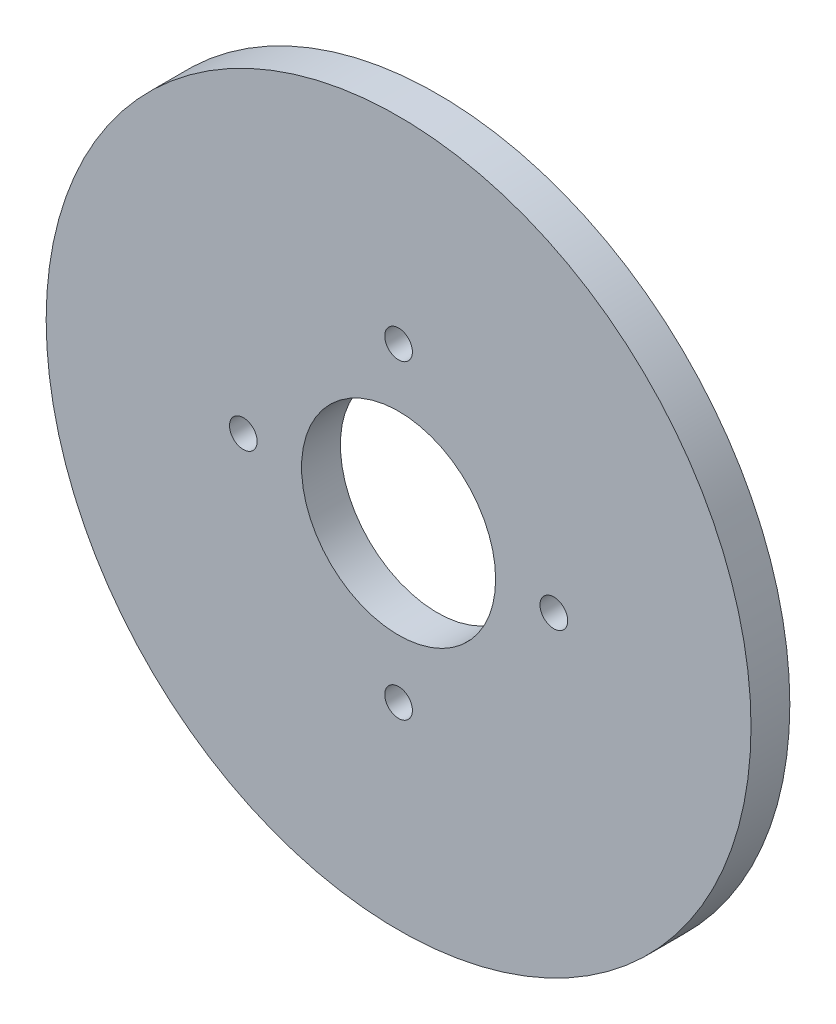
ISO-10303-21;
HEADER;
FILE_DESCRIPTION(('STEP AP214'),'2;1');
FILE_NAME('part.step','',(''),(''),'','','');
FILE_SCHEMA(('AUTOMOTIVE_DESIGN { 1 0 10303 214 1 1 1 1 }'));
ENDSEC;
DATA;
#1=APPLICATION_CONTEXT('core data for automotive mechanical design processes');
#2=APPLICATION_PROTOCOL_DEFINITION('international standard','automotive_design',2000,#1);
#3=PRODUCT_CONTEXT('',#1,'mechanical');
#4=PRODUCT('Part','Part','',(#3));
#5=PRODUCT_RELATED_PRODUCT_CATEGORY('part','',(#4));
#6=PRODUCT_DEFINITION_FORMATION('','',#4);
#7=PRODUCT_DEFINITION_CONTEXT('part definition',#1,'design');
#8=PRODUCT_DEFINITION('design','',#6,#7);
#9=PRODUCT_DEFINITION_SHAPE('','',#8);
#10=(LENGTH_UNIT() NAMED_UNIT(*) SI_UNIT(.MILLI.,.METRE.));
#11=(NAMED_UNIT(*) PLANE_ANGLE_UNIT() SI_UNIT($,.RADIAN.));
#12=(NAMED_UNIT(*) SI_UNIT($,.STERADIAN.) SOLID_ANGLE_UNIT());
#13=UNCERTAINTY_MEASURE_WITH_UNIT(LENGTH_MEASURE(1.E-05),#10,'distance_accuracy_value','');
#14=(GEOMETRIC_REPRESENTATION_CONTEXT(3) GLOBAL_UNCERTAINTY_ASSIGNED_CONTEXT((#13)) GLOBAL_UNIT_ASSIGNED_CONTEXT((#10,
#11,#12)) REPRESENTATION_CONTEXT('',''));
#15=CARTESIAN_POINT('',(0.,0.,0.));
#16=DIRECTION('',(0.,0.,1.));
#17=DIRECTION('',(1.,0.,0.));
#18=AXIS2_PLACEMENT_3D('',#15,#16,#17);
#19=CARTESIAN_POINT('',(0.,0.,3.175));
#20=DIRECTION('',(0.,0.,1.));
#21=DIRECTION('',(1.,0.,0.));
#22=AXIS2_PLACEMENT_3D('',#19,#20,#21);
#23=PLANE('',#22);
#24=CARTESIAN_POINT('',(0.,12.7,3.175));
#25=DIRECTION('',(0.,0.,1.));
#26=DIRECTION('',(1.,0.,0.));
#27=AXIS2_PLACEMENT_3D('',#24,#25,#26);
#28=CIRCLE('',#27,1.1303);
#29=CARTESIAN_POINT('',(1.1303,12.7,3.175));
#30=VERTEX_POINT('',#29);
#31=EDGE_CURVE('E63',#30,#30,#28,.T.);
#32=ORIENTED_EDGE('',*,*,#31,.F.);
#33=EDGE_LOOP('',(#32));
#34=FACE_BOUND('',#33,.T.);
#35=CARTESIAN_POINT('',(0.,-12.7,3.175));
#36=DIRECTION('',(0.,0.,1.));
#37=DIRECTION('',(1.,0.,0.));
#38=AXIS2_PLACEMENT_3D('',#35,#36,#37);
#39=CIRCLE('',#38,1.1303);
#40=CARTESIAN_POINT('',(1.1303,-12.7,3.175));
#41=VERTEX_POINT('',#40);
#42=EDGE_CURVE('E52',#41,#41,#39,.T.);
#43=ORIENTED_EDGE('',*,*,#42,.F.);
#44=EDGE_LOOP('',(#43));
#45=FACE_BOUND('',#44,.T.);
#46=CARTESIAN_POINT('',(12.7,0.,3.175));
#47=DIRECTION('',(0.,0.,1.));
#48=DIRECTION('',(1.,0.,0.));
#49=AXIS2_PLACEMENT_3D('',#46,#47,#48);
#50=CIRCLE('',#49,1.1303);
#51=CARTESIAN_POINT('',(13.8303,0.,3.175));
#52=VERTEX_POINT('',#51);
#53=EDGE_CURVE('E51',#52,#52,#50,.T.);
#54=ORIENTED_EDGE('',*,*,#53,.F.);
#55=EDGE_LOOP('',(#54));
#56=FACE_BOUND('',#55,.T.);
#57=CARTESIAN_POINT('',(-12.7,0.,3.175));
#58=DIRECTION('',(0.,0.,1.));
#59=DIRECTION('',(1.,0.,0.));
#60=AXIS2_PLACEMENT_3D('',#57,#58,#59);
#61=CIRCLE('',#60,1.1303);
#62=CARTESIAN_POINT('',(-11.5697,0.,3.175));
#63=VERTEX_POINT('',#62);
#64=EDGE_CURVE('E68',#63,#63,#61,.T.);
#65=ORIENTED_EDGE('',*,*,#64,.F.);
#66=EDGE_LOOP('',(#65));
#67=FACE_BOUND('',#66,.T.);
#68=CARTESIAN_POINT('',(0.,0.,3.175));
#69=DIRECTION('',(0.,0.,1.));
#70=DIRECTION('',(1.,0.,0.));
#71=AXIS2_PLACEMENT_3D('',#68,#69,#70);
#72=CIRCLE('',#71,28.829);
#73=CARTESIAN_POINT('',(28.829,0.,3.175));
#74=VERTEX_POINT('',#73);
#75=EDGE_CURVE('E10',#74,#74,#72,.T.);
#76=ORIENTED_EDGE('',*,*,#75,.T.);
#77=EDGE_LOOP('',(#76));
#78=FACE_BOUND('',#77,.T.);
#79=CARTESIAN_POINT('',(0.,0.,3.175));
#80=DIRECTION('',(0.,0.,1.));
#81=DIRECTION('',(1.,0.,0.));
#82=AXIS2_PLACEMENT_3D('',#79,#80,#81);
#83=CIRCLE('',#82,7.9375);
#84=CARTESIAN_POINT('',(7.9375,0.,3.175));
#85=VERTEX_POINT('',#84);
#86=EDGE_CURVE('E44',#85,#85,#83,.T.);
#87=ORIENTED_EDGE('',*,*,#86,.F.);
#88=EDGE_LOOP('',(#87));
#89=FACE_BOUND('',#88,.T.);
#90=ADVANCED_FACE('F31',(#34,#45,#56,#67,#78,#89),#23,.T.);
#91=CARTESIAN_POINT('',(0.,0.,0.));
#92=DIRECTION('',(0.,0.,1.));
#93=DIRECTION('',(1.,0.,0.));
#94=AXIS2_PLACEMENT_3D('',#91,#92,#93);
#95=PLANE('',#94);
#96=CARTESIAN_POINT('',(0.,12.7,0.));
#97=DIRECTION('',(0.,0.,1.));
#98=DIRECTION('',(1.,0.,0.));
#99=AXIS2_PLACEMENT_3D('',#96,#97,#98);
#100=CIRCLE('',#99,1.1303);
#101=CARTESIAN_POINT('',(1.1303,12.7,0.));
#102=VERTEX_POINT('',#101);
#103=EDGE_CURVE('E35',#102,#102,#100,.T.);
#104=ORIENTED_EDGE('',*,*,#103,.T.);
#105=EDGE_LOOP('',(#104));
#106=FACE_BOUND('',#105,.T.);
#107=CARTESIAN_POINT('',(0.,-12.7,0.));
#108=DIRECTION('',(0.,0.,1.));
#109=DIRECTION('',(1.,0.,0.));
#110=AXIS2_PLACEMENT_3D('',#107,#108,#109);
#111=CIRCLE('',#110,1.1303);
#112=CARTESIAN_POINT('',(1.1303,-12.7,0.));
#113=VERTEX_POINT('',#112);
#114=EDGE_CURVE('E49',#113,#113,#111,.T.);
#115=ORIENTED_EDGE('',*,*,#114,.T.);
#116=EDGE_LOOP('',(#115));
#117=FACE_BOUND('',#116,.T.);
#118=CARTESIAN_POINT('',(12.7,0.,0.));
#119=DIRECTION('',(0.,0.,1.));
#120=DIRECTION('',(1.,0.,0.));
#121=AXIS2_PLACEMENT_3D('',#118,#119,#120);
#122=CIRCLE('',#121,1.1303);
#123=CARTESIAN_POINT('',(13.8303,0.,0.));
#124=VERTEX_POINT('',#123);
#125=EDGE_CURVE('E56',#124,#124,#122,.T.);
#126=ORIENTED_EDGE('',*,*,#125,.T.);
#127=EDGE_LOOP('',(#126));
#128=FACE_BOUND('',#127,.T.);
#129=CARTESIAN_POINT('',(-12.7,0.,0.));
#130=DIRECTION('',(0.,0.,1.));
#131=DIRECTION('',(1.,0.,0.));
#132=AXIS2_PLACEMENT_3D('',#129,#130,#131);
#133=CIRCLE('',#132,1.1303);
#134=CARTESIAN_POINT('',(-11.5697,0.,0.));
#135=VERTEX_POINT('',#134);
#136=EDGE_CURVE('E71',#135,#135,#133,.T.);
#137=ORIENTED_EDGE('',*,*,#136,.T.);
#138=EDGE_LOOP('',(#137));
#139=FACE_BOUND('',#138,.T.);
#140=CARTESIAN_POINT('',(0.,0.,0.));
#141=DIRECTION('',(0.,0.,1.));
#142=DIRECTION('',(1.,0.,0.));
#143=AXIS2_PLACEMENT_3D('',#140,#141,#142);
#144=CIRCLE('',#143,28.829);
#145=CARTESIAN_POINT('',(28.829,0.,0.));
#146=VERTEX_POINT('',#145);
#147=EDGE_CURVE('E39',#146,#146,#144,.T.);
#148=ORIENTED_EDGE('',*,*,#147,.F.);
#149=EDGE_LOOP('',(#148));
#150=FACE_BOUND('',#149,.T.);
#151=CARTESIAN_POINT('',(0.,0.,0.));
#152=DIRECTION('',(0.,0.,1.));
#153=DIRECTION('',(1.,0.,0.));
#154=AXIS2_PLACEMENT_3D('',#151,#152,#153);
#155=CIRCLE('',#154,7.9375);
#156=CARTESIAN_POINT('',(7.9375,0.,0.));
#157=VERTEX_POINT('',#156);
#158=EDGE_CURVE('E47',#157,#157,#155,.T.);
#159=ORIENTED_EDGE('',*,*,#158,.T.);
#160=EDGE_LOOP('',(#159));
#161=FACE_BOUND('',#160,.T.);
#162=ADVANCED_FACE('F79',(#106,#117,#128,#139,#150,#161),#95,.F.);
#163=CARTESIAN_POINT('',(0.,0.,3.175));
#164=DIRECTION('',(0.,0.,-1.));
#165=DIRECTION('',(-1.,0.,0.));
#166=AXIS2_PLACEMENT_3D('',#163,#164,#165);
#167=CYLINDRICAL_SURFACE('',#166,28.829);
#168=ORIENTED_EDGE('',*,*,#75,.F.);
#169=EDGE_LOOP('',(#168));
#170=FACE_BOUND('',#169,.T.);
#171=ORIENTED_EDGE('',*,*,#147,.T.);
#172=EDGE_LOOP('',(#171));
#173=FACE_BOUND('',#172,.T.);
#174=ADVANCED_FACE('F33',(#170,#173),#167,.T.);
#175=CARTESIAN_POINT('',(0.,0.,3.175));
#176=DIRECTION('',(0.,0.,-1.));
#177=DIRECTION('',(-1.,0.,0.));
#178=AXIS2_PLACEMENT_3D('',#175,#176,#177);
#179=CYLINDRICAL_SURFACE('',#178,7.9375);
#180=ORIENTED_EDGE('',*,*,#86,.T.);
#181=EDGE_LOOP('',(#180));
#182=FACE_BOUND('',#181,.T.);
#183=ORIENTED_EDGE('',*,*,#158,.F.);
#184=EDGE_LOOP('',(#183));
#185=FACE_BOUND('',#184,.T.);
#186=ADVANCED_FACE('F81',(#182,#185),#179,.F.);
#187=CARTESIAN_POINT('',(-12.7,0.,3.175));
#188=DIRECTION('',(0.,0.,1.));
#189=DIRECTION('',(1.,0.,0.));
#190=AXIS2_PLACEMENT_3D('',#187,#188,#189);
#191=CYLINDRICAL_SURFACE('',#190,1.1303);
#192=ORIENTED_EDGE('',*,*,#64,.T.);
#193=EDGE_LOOP('',(#192));
#194=FACE_BOUND('',#193,.T.);
#195=ORIENTED_EDGE('',*,*,#136,.F.);
#196=EDGE_LOOP('',(#195));
#197=FACE_BOUND('',#196,.T.);
#198=ADVANCED_FACE('F83',(#194,#197),#191,.F.);
#199=CARTESIAN_POINT('',(12.7,0.,3.175));
#200=DIRECTION('',(0.,0.,1.));
#201=DIRECTION('',(1.,0.,0.));
#202=AXIS2_PLACEMENT_3D('',#199,#200,#201);
#203=CYLINDRICAL_SURFACE('',#202,1.1303);
#204=ORIENTED_EDGE('',*,*,#53,.T.);
#205=EDGE_LOOP('',(#204));
#206=FACE_BOUND('',#205,.T.);
#207=ORIENTED_EDGE('',*,*,#125,.F.);
#208=EDGE_LOOP('',(#207));
#209=FACE_BOUND('',#208,.T.);
#210=ADVANCED_FACE('F89',(#206,#209),#203,.F.);
#211=CARTESIAN_POINT('',(0.,-12.7,3.175));
#212=DIRECTION('',(0.,0.,1.));
#213=DIRECTION('',(1.,0.,0.));
#214=AXIS2_PLACEMENT_3D('',#211,#212,#213);
#215=CYLINDRICAL_SURFACE('',#214,1.1303);
#216=ORIENTED_EDGE('',*,*,#42,.T.);
#217=EDGE_LOOP('',(#216));
#218=FACE_BOUND('',#217,.T.);
#219=ORIENTED_EDGE('',*,*,#114,.F.);
#220=EDGE_LOOP('',(#219));
#221=FACE_BOUND('',#220,.T.);
#222=ADVANCED_FACE('F117',(#218,#221),#215,.F.);
#223=CARTESIAN_POINT('',(0.,12.7,3.175));
#224=DIRECTION('',(0.,0.,1.));
#225=DIRECTION('',(1.,0.,0.));
#226=AXIS2_PLACEMENT_3D('',#223,#224,#225);
#227=CYLINDRICAL_SURFACE('',#226,1.1303);
#228=ORIENTED_EDGE('',*,*,#31,.T.);
#229=EDGE_LOOP('',(#228));
#230=FACE_BOUND('',#229,.T.);
#231=ORIENTED_EDGE('',*,*,#103,.F.);
#232=EDGE_LOOP('',(#231));
#233=FACE_BOUND('',#232,.T.);
#234=ADVANCED_FACE('F124',(#230,#233),#227,.F.);
#235=CLOSED_SHELL('',(#90,#162,#174,#186,#198,#210,#222,#234));
#236=MANIFOLD_SOLID_BREP('B2',#235);
#237=ADVANCED_BREP_SHAPE_REPRESENTATION('',(#18,#236),#14);
#238=SHAPE_DEFINITION_REPRESENTATION(#9,#237);
ENDSEC;
END-ISO-10303-21;
